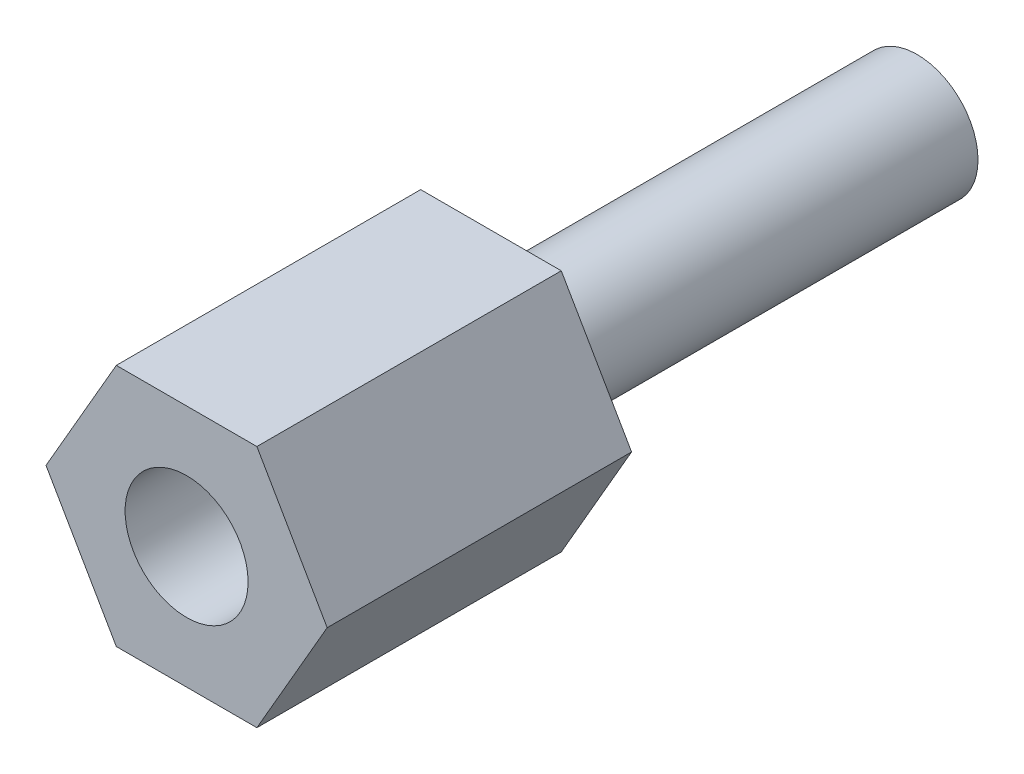
ISO-10303-21;
HEADER;
FILE_DESCRIPTION(('STEP AP214'),'2;1');
FILE_NAME('part.step','',(''),(''),'','','');
FILE_SCHEMA(('AUTOMOTIVE_DESIGN { 1 0 10303 214 1 1 1 1 }'));
ENDSEC;
DATA;
#1=APPLICATION_CONTEXT('core data for automotive mechanical design processes');
#2=APPLICATION_PROTOCOL_DEFINITION('international standard','automotive_design',2000,#1);
#3=PRODUCT_CONTEXT('',#1,'mechanical');
#4=PRODUCT('Part','Part','',(#3));
#5=PRODUCT_RELATED_PRODUCT_CATEGORY('part','',(#4));
#6=PRODUCT_DEFINITION_FORMATION('','',#4);
#7=PRODUCT_DEFINITION_CONTEXT('part definition',#1,'design');
#8=PRODUCT_DEFINITION('design','',#6,#7);
#9=PRODUCT_DEFINITION_SHAPE('','',#8);
#10=(LENGTH_UNIT() NAMED_UNIT(*) SI_UNIT(.MILLI.,.METRE.));
#11=(NAMED_UNIT(*) PLANE_ANGLE_UNIT() SI_UNIT($,.RADIAN.));
#12=(NAMED_UNIT(*) SI_UNIT($,.STERADIAN.) SOLID_ANGLE_UNIT());
#13=UNCERTAINTY_MEASURE_WITH_UNIT(LENGTH_MEASURE(1.E-05),#10,'distance_accuracy_value','');
#14=(GEOMETRIC_REPRESENTATION_CONTEXT(3) GLOBAL_UNCERTAINTY_ASSIGNED_CONTEXT((#13)) GLOBAL_UNIT_ASSIGNED_CONTEXT((#10,
#11,#12)) REPRESENTATION_CONTEXT('',''));
#15=CARTESIAN_POINT('',(0.,0.,0.));
#16=DIRECTION('',(0.,0.,1.));
#17=DIRECTION('',(1.,0.,0.));
#18=AXIS2_PLACEMENT_3D('',#15,#16,#17);
#19=CARTESIAN_POINT('',(0.,0.,5.));
#20=DIRECTION('',(0.,0.,1.));
#21=DIRECTION('',(1.,0.,0.));
#22=AXIS2_PLACEMENT_3D('',#19,#20,#21);
#23=PLANE('',#22);
#24=DIRECTION('',(0.5,0.866025403784439,0.));
#25=VECTOR('',#24,1.);
#26=CARTESIAN_POINT('',(1.15470053837925,-2.,5.));
#27=LINE('',#26,#25);
#28=CARTESIAN_POINT('',(1.15470053837925,-2.,5.));
#29=VERTEX_POINT('',#28);
#30=CARTESIAN_POINT('',(2.3094010767585,0.,5.));
#31=VERTEX_POINT('',#30);
#32=EDGE_CURVE('E145',#29,#31,#27,.T.);
#33=ORIENTED_EDGE('',*,*,#32,.T.);
#34=DIRECTION('',(-0.5,0.866025403784439,0.));
#35=VECTOR('',#34,1.);
#36=CARTESIAN_POINT('',(2.3094010767585,0.,5.));
#37=LINE('',#36,#35);
#38=CARTESIAN_POINT('',(1.15470053837925,2.,5.));
#39=VERTEX_POINT('',#38);
#40=EDGE_CURVE('E105',#31,#39,#37,.T.);
#41=ORIENTED_EDGE('',*,*,#40,.T.);
#42=DIRECTION('',(-1.,0.,0.));
#43=VECTOR('',#42,1.);
#44=CARTESIAN_POINT('',(1.15470053837925,2.,5.));
#45=LINE('',#44,#43);
#46=CARTESIAN_POINT('',(-1.15470053837925,2.,5.));
#47=VERTEX_POINT('',#46);
#48=EDGE_CURVE('E113',#39,#47,#45,.T.);
#49=ORIENTED_EDGE('',*,*,#48,.T.);
#50=DIRECTION('',(-0.5,-0.866025403784439,0.));
#51=VECTOR('',#50,1.);
#52=CARTESIAN_POINT('',(-1.15470053837925,2.,5.));
#53=LINE('',#52,#51);
#54=CARTESIAN_POINT('',(-2.3094010767585,0.,5.));
#55=VERTEX_POINT('',#54);
#56=EDGE_CURVE('E108',#47,#55,#53,.T.);
#57=ORIENTED_EDGE('',*,*,#56,.T.);
#58=DIRECTION('',(0.5,-0.866025403784439,0.));
#59=VECTOR('',#58,1.);
#60=CARTESIAN_POINT('',(-2.3094010767585,0.,5.));
#61=LINE('',#60,#59);
#62=CARTESIAN_POINT('',(-1.15470053837925,-2.,5.));
#63=VERTEX_POINT('',#62);
#64=EDGE_CURVE('E114',#55,#63,#61,.T.);
#65=ORIENTED_EDGE('',*,*,#64,.T.);
#66=DIRECTION('',(1.,0.,0.));
#67=VECTOR('',#66,1.);
#68=CARTESIAN_POINT('',(-1.15470053837925,-2.,5.));
#69=LINE('',#68,#67);
#70=EDGE_CURVE('E64',#63,#29,#69,.T.);
#71=ORIENTED_EDGE('',*,*,#70,.T.);
#72=EDGE_LOOP('',(#33,#41,#49,#57,#65,#71));
#73=FACE_BOUND('',#72,.T.);
#74=CARTESIAN_POINT('',(0.,0.,5.));
#75=DIRECTION('',(0.,0.,1.));
#76=DIRECTION('',(1.,0.,0.));
#77=AXIS2_PLACEMENT_3D('',#74,#75,#76);
#78=CIRCLE('',#77,1.01);
#79=CARTESIAN_POINT('',(1.01,0.,5.));
#80=VERTEX_POINT('',#79);
#81=EDGE_CURVE('E139',#80,#80,#78,.T.);
#82=ORIENTED_EDGE('',*,*,#81,.F.);
#83=EDGE_LOOP('',(#82));
#84=FACE_BOUND('',#83,.T.);
#85=ADVANCED_FACE('F50',(#73,#84),#23,.T.);
#86=CARTESIAN_POINT('',(0.,0.,0.));
#87=DIRECTION('',(0.,0.,1.));
#88=DIRECTION('',(1.,0.,0.));
#89=AXIS2_PLACEMENT_3D('',#86,#87,#88);
#90=PLANE('',#89);
#91=CARTESIAN_POINT('',(0.,0.,0.));
#92=DIRECTION('',(0.,0.,1.));
#93=DIRECTION('',(1.,0.,0.));
#94=AXIS2_PLACEMENT_3D('',#91,#92,#93);
#95=CIRCLE('',#94,1.);
#96=CARTESIAN_POINT('',(1.,0.,0.));
#97=VERTEX_POINT('',#96);
#98=EDGE_CURVE('E164',#97,#97,#95,.T.);
#99=ORIENTED_EDGE('',*,*,#98,.T.);
#100=EDGE_LOOP('',(#99));
#101=FACE_BOUND('',#100,.T.);
#102=DIRECTION('',(0.5,0.866025403784439,0.));
#103=VECTOR('',#102,1.);
#104=CARTESIAN_POINT('',(1.15470053837925,-2.,0.));
#105=LINE('',#104,#103);
#106=CARTESIAN_POINT('',(1.15470053837925,-2.,0.));
#107=VERTEX_POINT('',#106);
#108=CARTESIAN_POINT('',(2.3094010767585,0.,0.));
#109=VERTEX_POINT('',#108);
#110=EDGE_CURVE('E131',#107,#109,#105,.T.);
#111=ORIENTED_EDGE('',*,*,#110,.F.);
#112=DIRECTION('',(1.,0.,0.));
#113=VECTOR('',#112,1.);
#114=CARTESIAN_POINT('',(-1.15470053837925,-2.,0.));
#115=LINE('',#114,#113);
#116=CARTESIAN_POINT('',(-1.15470053837925,-2.,0.));
#117=VERTEX_POINT('',#116);
#118=EDGE_CURVE('E91',#117,#107,#115,.T.);
#119=ORIENTED_EDGE('',*,*,#118,.F.);
#120=DIRECTION('',(0.5,-0.866025403784439,0.));
#121=VECTOR('',#120,1.);
#122=CARTESIAN_POINT('',(-2.3094010767585,0.,0.));
#123=LINE('',#122,#121);
#124=CARTESIAN_POINT('',(-2.3094010767585,0.,0.));
#125=VERTEX_POINT('',#124);
#126=EDGE_CURVE('E87',#125,#117,#123,.T.);
#127=ORIENTED_EDGE('',*,*,#126,.F.);
#128=DIRECTION('',(-0.5,-0.866025403784439,0.));
#129=VECTOR('',#128,1.);
#130=CARTESIAN_POINT('',(-1.15470053837925,2.,0.));
#131=LINE('',#130,#129);
#132=CARTESIAN_POINT('',(-1.15470053837925,2.,0.));
#133=VERTEX_POINT('',#132);
#134=EDGE_CURVE('E125',#133,#125,#131,.T.);
#135=ORIENTED_EDGE('',*,*,#134,.F.);
#136=DIRECTION('',(-1.,0.,0.));
#137=VECTOR('',#136,1.);
#138=CARTESIAN_POINT('',(1.15470053837925,2.,0.));
#139=LINE('',#138,#137);
#140=CARTESIAN_POINT('',(1.15470053837925,2.,0.));
#141=VERTEX_POINT('',#140);
#142=EDGE_CURVE('E136',#141,#133,#139,.T.);
#143=ORIENTED_EDGE('',*,*,#142,.F.);
#144=DIRECTION('',(-0.5,0.866025403784439,0.));
#145=VECTOR('',#144,1.);
#146=CARTESIAN_POINT('',(2.3094010767585,0.,0.));
#147=LINE('',#146,#145);
#148=EDGE_CURVE('E137',#109,#141,#147,.T.);
#149=ORIENTED_EDGE('',*,*,#148,.F.);
#150=EDGE_LOOP('',(#111,#119,#127,#135,#143,#149));
#151=FACE_BOUND('',#150,.T.);
#152=ADVANCED_FACE('F156',(#101,#151),#90,.F.);
#153=CARTESIAN_POINT('',(1.15470053837925,-2.,5.));
#154=DIRECTION('',(-0.866025403784439,0.5,0.));
#155=DIRECTION('',(-0.5,-0.866025403784439,0.));
#156=AXIS2_PLACEMENT_3D('',#153,#154,#155);
#157=PLANE('',#156);
#158=ORIENTED_EDGE('',*,*,#110,.T.);
#159=DIRECTION('',(0.,0.,-1.));
#160=VECTOR('',#159,1.);
#161=CARTESIAN_POINT('',(2.3094010767585,0.,5.));
#162=LINE('',#161,#160);
#163=EDGE_CURVE('E57',#31,#109,#162,.T.);
#164=ORIENTED_EDGE('',*,*,#163,.F.);
#165=ORIENTED_EDGE('',*,*,#32,.F.);
#166=DIRECTION('',(0.,0.,-1.));
#167=VECTOR('',#166,1.);
#168=CARTESIAN_POINT('',(1.15470053837925,-2.,5.));
#169=LINE('',#168,#167);
#170=EDGE_CURVE('E129',#29,#107,#169,.T.);
#171=ORIENTED_EDGE('',*,*,#170,.T.);
#172=EDGE_LOOP('',(#158,#164,#165,#171));
#173=FACE_BOUND('',#172,.T.);
#174=ADVANCED_FACE('F47',(#173),#157,.F.);
#175=CARTESIAN_POINT('',(2.3094010767585,0.,5.));
#176=DIRECTION('',(-0.866025403784439,-0.5,0.));
#177=DIRECTION('',(0.5,-0.866025403784439,0.));
#178=AXIS2_PLACEMENT_3D('',#175,#176,#177);
#179=PLANE('',#178);
#180=ORIENTED_EDGE('',*,*,#148,.T.);
#181=DIRECTION('',(0.,0.,-1.));
#182=VECTOR('',#181,1.);
#183=CARTESIAN_POINT('',(1.15470053837925,2.,5.));
#184=LINE('',#183,#182);
#185=EDGE_CURVE('E146',#39,#141,#184,.T.);
#186=ORIENTED_EDGE('',*,*,#185,.F.);
#187=ORIENTED_EDGE('',*,*,#40,.F.);
#188=ORIENTED_EDGE('',*,*,#163,.T.);
#189=EDGE_LOOP('',(#180,#186,#187,#188));
#190=FACE_BOUND('',#189,.T.);
#191=ADVANCED_FACE('F151',(#190),#179,.F.);
#192=CARTESIAN_POINT('',(1.15470053837925,2.,5.));
#193=DIRECTION('',(0.,-1.,0.));
#194=DIRECTION('',(1.,0.,0.));
#195=AXIS2_PLACEMENT_3D('',#192,#193,#194);
#196=PLANE('',#195);
#197=ORIENTED_EDGE('',*,*,#142,.T.);
#198=DIRECTION('',(0.,0.,-1.));
#199=VECTOR('',#198,1.);
#200=CARTESIAN_POINT('',(-1.15470053837925,2.,5.));
#201=LINE('',#200,#199);
#202=EDGE_CURVE('E121',#47,#133,#201,.T.);
#203=ORIENTED_EDGE('',*,*,#202,.F.);
#204=ORIENTED_EDGE('',*,*,#48,.F.);
#205=ORIENTED_EDGE('',*,*,#185,.T.);
#206=EDGE_LOOP('',(#197,#203,#204,#205));
#207=FACE_BOUND('',#206,.T.);
#208=ADVANCED_FACE('F157',(#207),#196,.F.);
#209=CARTESIAN_POINT('',(-1.15470053837925,2.,5.));
#210=DIRECTION('',(0.866025403784438,-0.5,0.));
#211=DIRECTION('',(0.5,0.866025403784439,0.));
#212=AXIS2_PLACEMENT_3D('',#209,#210,#211);
#213=PLANE('',#212);
#214=ORIENTED_EDGE('',*,*,#134,.T.);
#215=DIRECTION('',(0.,0.,-1.));
#216=VECTOR('',#215,1.);
#217=CARTESIAN_POINT('',(-2.3094010767585,0.,5.));
#218=LINE('',#217,#216);
#219=EDGE_CURVE('E117',#55,#125,#218,.T.);
#220=ORIENTED_EDGE('',*,*,#219,.F.);
#221=ORIENTED_EDGE('',*,*,#56,.F.);
#222=ORIENTED_EDGE('',*,*,#202,.T.);
#223=EDGE_LOOP('',(#214,#220,#221,#222));
#224=FACE_BOUND('',#223,.T.);
#225=ADVANCED_FACE('F122',(#224),#213,.F.);
#226=CARTESIAN_POINT('',(-2.3094010767585,0.,5.));
#227=DIRECTION('',(0.866025403784439,0.5,0.));
#228=DIRECTION('',(-0.5,0.866025403784439,0.));
#229=AXIS2_PLACEMENT_3D('',#226,#227,#228);
#230=PLANE('',#229);
#231=ORIENTED_EDGE('',*,*,#126,.T.);
#232=DIRECTION('',(0.,0.,-1.));
#233=VECTOR('',#232,1.);
#234=CARTESIAN_POINT('',(-1.15470053837925,-2.,5.));
#235=LINE('',#234,#233);
#236=EDGE_CURVE('E123',#63,#117,#235,.T.);
#237=ORIENTED_EDGE('',*,*,#236,.F.);
#238=ORIENTED_EDGE('',*,*,#64,.F.);
#239=ORIENTED_EDGE('',*,*,#219,.T.);
#240=EDGE_LOOP('',(#231,#237,#238,#239));
#241=FACE_BOUND('',#240,.T.);
#242=ADVANCED_FACE('F130',(#241),#230,.F.);
#243=CARTESIAN_POINT('',(-1.15470053837925,-2.,5.));
#244=DIRECTION('',(0.,1.,0.));
#245=DIRECTION('',(-1.,0.,0.));
#246=AXIS2_PLACEMENT_3D('',#243,#244,#245);
#247=PLANE('',#246);
#248=ORIENTED_EDGE('',*,*,#118,.T.);
#249=ORIENTED_EDGE('',*,*,#170,.F.);
#250=ORIENTED_EDGE('',*,*,#70,.F.);
#251=ORIENTED_EDGE('',*,*,#236,.T.);
#252=EDGE_LOOP('',(#248,#249,#250,#251));
#253=FACE_BOUND('',#252,.T.);
#254=ADVANCED_FACE('F193',(#253),#247,.F.);
#255=CARTESIAN_POINT('',(0.,0.,5.));
#256=DIRECTION('',(0.,0.,-1.));
#257=DIRECTION('',(-1.,0.,0.));
#258=AXIS2_PLACEMENT_3D('',#255,#256,#257);
#259=CYLINDRICAL_SURFACE('',#258,1.01);
#260=CARTESIAN_POINT('',(0.,0.,0.45));
#261=DIRECTION('',(0.,0.,1.));
#262=DIRECTION('',(1.,0.,0.));
#263=AXIS2_PLACEMENT_3D('',#260,#261,#262);
#264=CIRCLE('',#263,1.01);
#265=CARTESIAN_POINT('',(1.01,0.,0.45));
#266=VERTEX_POINT('',#265);
#267=EDGE_CURVE('E11',#266,#266,#264,.T.);
#268=ORIENTED_EDGE('',*,*,#267,.F.);
#269=EDGE_LOOP('',(#268));
#270=FACE_BOUND('',#269,.T.);
#271=ORIENTED_EDGE('',*,*,#81,.T.);
#272=EDGE_LOOP('',(#271));
#273=FACE_BOUND('',#272,.T.);
#274=ADVANCED_FACE('F194',(#270,#273),#259,.F.);
#275=CARTESIAN_POINT('',(0.,0.,0.45));
#276=DIRECTION('',(0.,0.,1.));
#277=DIRECTION('',(1.,0.,0.));
#278=AXIS2_PLACEMENT_3D('',#275,#276,#277);
#279=PLANE('',#278);
#280=ORIENTED_EDGE('',*,*,#267,.T.);
#281=EDGE_LOOP('',(#280));
#282=FACE_BOUND('',#281,.T.);
#283=ADVANCED_FACE('F179',(#282),#279,.T.);
#284=CARTESIAN_POINT('',(0.,0.,0.));
#285=DIRECTION('',(0.,0.,-1.));
#286=DIRECTION('',(-1.,0.,0.));
#287=AXIS2_PLACEMENT_3D('',#284,#285,#286);
#288=CYLINDRICAL_SURFACE('',#287,1.);
#289=ORIENTED_EDGE('',*,*,#98,.F.);
#290=EDGE_LOOP('',(#289));
#291=FACE_BOUND('',#290,.T.);
#292=CARTESIAN_POINT('',(0.,0.,-7.));
#293=DIRECTION('',(0.,0.,1.));
#294=DIRECTION('',(1.,0.,0.));
#295=AXIS2_PLACEMENT_3D('',#292,#293,#294);
#296=CIRCLE('',#295,1.);
#297=CARTESIAN_POINT('',(1.,0.,-7.));
#298=VERTEX_POINT('',#297);
#299=EDGE_CURVE('E167',#298,#298,#296,.T.);
#300=ORIENTED_EDGE('',*,*,#299,.T.);
#301=EDGE_LOOP('',(#300));
#302=FACE_BOUND('',#301,.T.);
#303=ADVANCED_FACE('F171',(#291,#302),#288,.T.);
#304=CARTESIAN_POINT('',(0.,0.,-7.));
#305=DIRECTION('',(0.,0.,1.));
#306=DIRECTION('',(1.,0.,0.));
#307=AXIS2_PLACEMENT_3D('',#304,#305,#306);
#308=PLANE('',#307);
#309=ORIENTED_EDGE('',*,*,#299,.F.);
#310=EDGE_LOOP('',(#309));
#311=FACE_BOUND('',#310,.T.);
#312=ADVANCED_FACE('F177',(#311),#308,.F.);
#313=CLOSED_SHELL('',(#85,#152,#174,#191,#208,#225,#242,#254,#274,#283,#303,#312));
#314=MANIFOLD_SOLID_BREP('B2',#313);
#315=ADVANCED_BREP_SHAPE_REPRESENTATION('',(#18,#314),#14);
#316=SHAPE_DEFINITION_REPRESENTATION(#9,#315);
ENDSEC;
END-ISO-10303-21;
